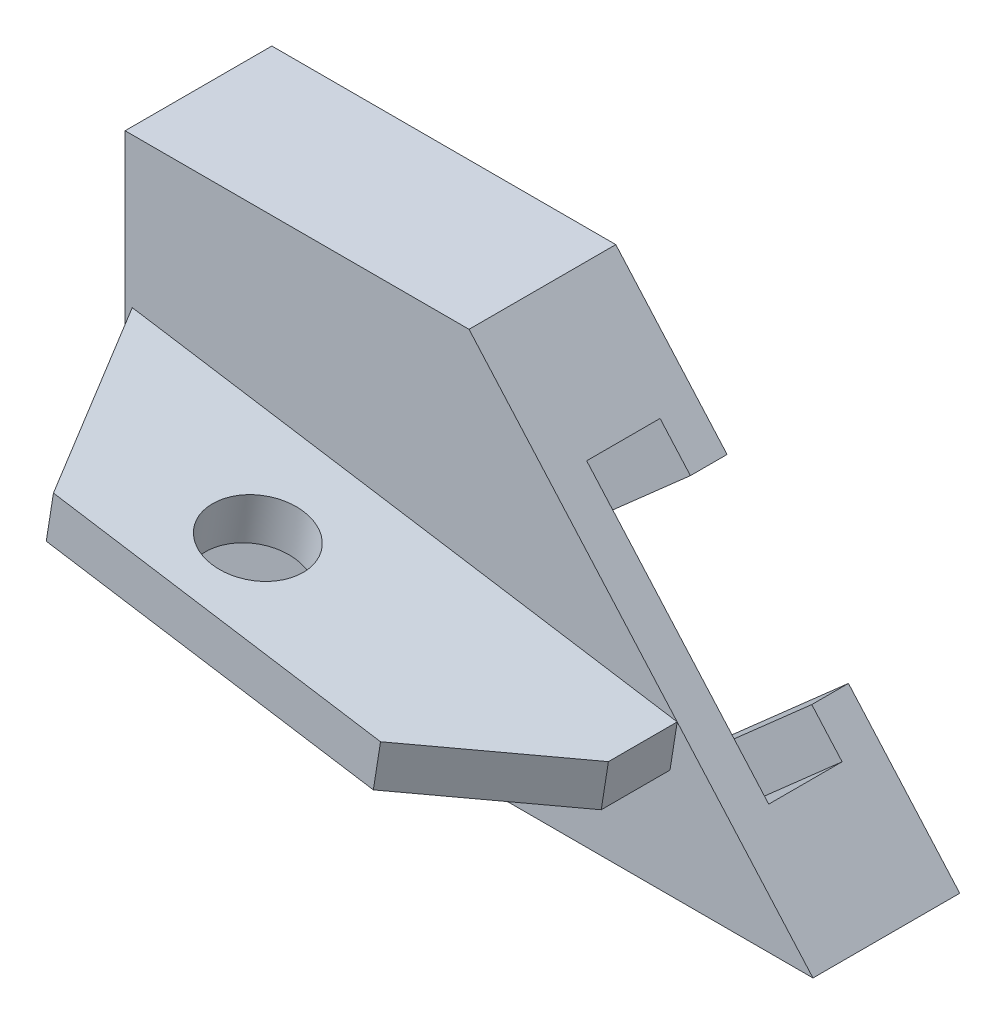
ISO-10303-21;
HEADER;
FILE_DESCRIPTION(('STEP AP214'),'2;1');
FILE_NAME('part.step','',(''),(''),'','','');
FILE_SCHEMA(('AUTOMOTIVE_DESIGN { 1 0 10303 214 1 1 1 1 }'));
ENDSEC;
DATA;
#1=APPLICATION_CONTEXT('core data for automotive mechanical design processes');
#2=APPLICATION_PROTOCOL_DEFINITION('international standard','automotive_design',2000,#1);
#3=PRODUCT_CONTEXT('',#1,'mechanical');
#4=PRODUCT('Part','Part','',(#3));
#5=PRODUCT_RELATED_PRODUCT_CATEGORY('part','',(#4));
#6=PRODUCT_DEFINITION_FORMATION('','',#4);
#7=PRODUCT_DEFINITION_CONTEXT('part definition',#1,'design');
#8=PRODUCT_DEFINITION('design','',#6,#7);
#9=PRODUCT_DEFINITION_SHAPE('','',#8);
#10=(LENGTH_UNIT() NAMED_UNIT(*) SI_UNIT(.MILLI.,.METRE.));
#11=(NAMED_UNIT(*) PLANE_ANGLE_UNIT() SI_UNIT($,.RADIAN.));
#12=(NAMED_UNIT(*) SI_UNIT($,.STERADIAN.) SOLID_ANGLE_UNIT());
#13=UNCERTAINTY_MEASURE_WITH_UNIT(LENGTH_MEASURE(1.E-05),#10,'distance_accuracy_value','');
#14=(GEOMETRIC_REPRESENTATION_CONTEXT(3) GLOBAL_UNCERTAINTY_ASSIGNED_CONTEXT((#13)) GLOBAL_UNIT_ASSIGNED_CONTEXT((#10,
#11,#12)) REPRESENTATION_CONTEXT('',''));
#15=CARTESIAN_POINT('',(0.,0.,0.));
#16=DIRECTION('',(0.,0.,1.));
#17=DIRECTION('',(1.,0.,0.));
#18=AXIS2_PLACEMENT_3D('',#15,#16,#17);
#19=CARTESIAN_POINT('',(112.260327889279,-17.7802892033924,72.));
#20=DIRECTION('',(0.987688340595138,-0.156434465040231,0.));
#21=DIRECTION('',(0.156434465040231,0.987688340595138,0.));
#22=AXIS2_PLACEMENT_3D('',#19,#20,#21);
#23=PLANE('',#22);
#24=DIRECTION('',(0.,0.,-1.));
#25=VECTOR('',#24,1.);
#26=CARTESIAN_POINT('',(120.391283670149,33.556545173831,72.));
#27=LINE('',#26,#25);
#28=CARTESIAN_POINT('',(120.391283670149,33.556545173831,47.));
#29=VERTEX_POINT('',#28);
#30=CARTESIAN_POINT('',(120.391283670149,33.556545173831,32.));
#31=VERTEX_POINT('',#30);
#32=EDGE_CURVE('E209',#29,#31,#27,.T.);
#33=ORIENTED_EDGE('',*,*,#32,.F.);
#34=DIRECTION('',(-0.156434465040231,-0.987688340595138,0.));
#35=VECTOR('',#34,1.);
#36=CARTESIAN_POINT('',(129.064490408317,88.317017354028,47.));
#37=LINE('',#36,#35);
#38=CARTESIAN_POINT('',(118.826939019747,23.6796617678796,47.));
#39=VERTEX_POINT('',#38);
#40=EDGE_CURVE('E192',#29,#39,#37,.T.);
#41=ORIENTED_EDGE('',*,*,#40,.T.);
#42=DIRECTION('',(0.,0.,-1.));
#43=VECTOR('',#42,1.);
#44=CARTESIAN_POINT('',(118.826939019747,23.6796617678796,72.));
#45=LINE('',#44,#43);
#46=CARTESIAN_POINT('',(118.826939019747,23.6796617678796,32.));
#47=VERTEX_POINT('',#46);
#48=EDGE_CURVE('E205',#39,#47,#45,.T.);
#49=ORIENTED_EDGE('',*,*,#48,.T.);
#50=DIRECTION('',(-0.156434465040231,-0.987688340595138,0.));
#51=VECTOR('',#50,1.);
#52=CARTESIAN_POINT('',(112.260327889279,-17.7802892033924,32.));
#53=LINE('',#52,#51);
#54=EDGE_CURVE('E264',#31,#47,#53,.T.);
#55=ORIENTED_EDGE('',*,*,#54,.F.);
#56=EDGE_LOOP('',(#33,#41,#49,#55));
#57=FACE_BOUND('',#56,.T.);
#58=ADVANCED_FACE('F68',(#57),#23,.T.);
#59=CARTESIAN_POINT('',(0.,0.,72.));
#60=DIRECTION('',(0.,0.,1.));
#61=DIRECTION('',(1.,0.,0.));
#62=AXIS2_PLACEMENT_3D('',#59,#60,#61);
#63=PLANE('',#62);
#64=DIRECTION('',(0.987688340595138,-0.156434465040231,0.));
#65=VECTOR('',#64,1.);
#66=CARTESIAN_POINT('',(8.13095578086995,51.3368343772234,72.));
#67=LINE('',#66,#65);
#68=CARTESIAN_POINT('',(24.3740298231243,48.7641841858909,72.));
#69=VERTEX_POINT('',#68);
#70=CARTESIAN_POINT('',(95.6990751552707,37.4674067998367,72.));
#71=VERTEX_POINT('',#70);
#72=EDGE_CURVE('E210',#69,#71,#67,.T.);
#73=ORIENTED_EDGE('',*,*,#72,.F.);
#74=DIRECTION('',(-0.156434465040231,-0.987688340595138,0.));
#75=VECTOR('',#74,1.);
#76=CARTESIAN_POINT('',(33.0472365612922,103.524656366088,72.));
#77=LINE('',#76,#75);
#78=CARTESIAN_POINT('',(22.809685172722,38.8873007799396,72.));
#79=VERTEX_POINT('',#78);
#80=EDGE_CURVE('E206',#69,#79,#77,.T.);
#81=ORIENTED_EDGE('',*,*,#80,.T.);
#82=DIRECTION('',(-0.987688340595138,0.156434465040231,0.));
#83=VECTOR('',#82,1.);
#84=CARTESIAN_POINT('',(6.56661113046764,41.459950971272,72.));
#85=LINE('',#84,#83);
#86=CARTESIAN_POINT('',(94.1347305048684,27.5905233938854,72.));
#87=VERTEX_POINT('',#86);
#88=EDGE_CURVE('E199',#87,#79,#85,.T.);
#89=ORIENTED_EDGE('',*,*,#88,.F.);
#90=DIRECTION('',(-0.156434465040231,-0.987688340595138,0.));
#91=VECTOR('',#90,1.);
#92=CARTESIAN_POINT('',(104.372281893439,92.2278789800338,72.));
#93=LINE('',#92,#91);
#94=EDGE_CURVE('E184',#71,#87,#93,.T.);
#95=ORIENTED_EDGE('',*,*,#94,.F.);
#96=EDGE_LOOP('',(#73,#81,#89,#95));
#97=FACE_BOUND('',#96,.T.);
#98=ADVANCED_FACE('F202',(#97),#63,.T.);
#99=CARTESIAN_POINT('',(8.13095578086995,51.3368343772234,72.));
#100=DIRECTION('',(0.156434465040231,0.987688340595138,0.));
#101=DIRECTION('',(-0.987688340595138,0.156434465040231,0.));
#102=AXIS2_PLACEMENT_3D('',#99,#100,#101);
#103=PLANE('',#102);
#104=CARTESIAN_POINT('',(50.9487616801592,44.5551601539398,54.));
#105=DIRECTION('',(0.156434465040231,0.987688340595138,0.));
#106=DIRECTION('',(-0.987688340595138,0.156434465040231,0.));
#107=AXIS2_PLACEMENT_3D('',#104,#105,#106);
#108=CIRCLE('',#107,10.);
#109=CARTESIAN_POINT('',(41.0718782742078,46.1195048043421,54.));
#110=VERTEX_POINT('',#109);
#111=EDGE_CURVE('E342',#110,#110,#108,.F.);
#112=ORIENTED_EDGE('',*,*,#111,.T.);
#113=EDGE_LOOP('',(#112));
#114=FACE_BOUND('',#113,.T.);
#115=DIRECTION('',(0.987688340595138,-0.156434465040231,0.));
#116=VECTOR('',#115,1.);
#117=CARTESIAN_POINT('',(8.13095578086995,51.3368343772234,32.));
#118=LINE('',#117,#116);
#119=CARTESIAN_POINT('',(1.56434465040231,52.3768834059514,32.));
#120=VERTEX_POINT('',#119);
#121=EDGE_CURVE('E232',#120,#31,#118,.T.);
#122=ORIENTED_EDGE('',*,*,#121,.F.);
#123=DIRECTION('',(0.493844170297564,-0.0782172325201147,0.866025403784442));
#124=VECTOR('',#123,1.);
#125=CARTESIAN_POINT('',(-10.4798136706141,54.2844906808057,10.8788696909855));
#126=LINE('',#125,#124);
#127=EDGE_CURVE('E201',#120,#69,#126,.T.);
#128=ORIENTED_EDGE('',*,*,#127,.T.);
#129=ORIENTED_EDGE('',*,*,#72,.T.);
#130=DIRECTION('',(0.698401123333712,-0.110615871041238,-0.707106781186546));
#131=VECTOR('',#130,1.);
#132=CARTESIAN_POINT('',(87.471795729495,38.7704798470818,80.3298334987109));
#133=LINE('',#132,#131);
#134=EDGE_CURVE('E95',#71,#29,#133,.T.);
#135=ORIENTED_EDGE('',*,*,#134,.T.);
#136=ORIENTED_EDGE('',*,*,#32,.T.);
#137=EDGE_LOOP('',(#122,#128,#129,#135,#136));
#138=FACE_BOUND('',#137,.T.);
#139=ADVANCED_FACE('F357',(#114,#138),#103,.T.);
#140=CARTESIAN_POINT('',(0.,0.,0.));
#141=DIRECTION('',(0.,0.,1.));
#142=DIRECTION('',(1.,0.,0.));
#143=AXIS2_PLACEMENT_3D('',#140,#141,#142);
#144=PLANE('',#143);
#145=DIRECTION('',(0.749837855365093,0.661621637086846,0.));
#146=VECTOR('',#145,1.);
#147=CARTESIAN_POINT('',(14.9279874917261,-16.9205191572896,0.));
#148=LINE('',#147,#146);
#149=CARTESIAN_POINT('',(34.1045758699877,0.,0.));
#150=VERTEX_POINT('',#149);
#151=CARTESIAN_POINT('',(99.2675672582631,57.4967571073019,0.));
#152=VERTEX_POINT('',#151);
#153=EDGE_CURVE('E256',#150,#152,#148,.T.);
#154=ORIENTED_EDGE('',*,*,#153,.F.);
#155=DIRECTION('',(1.,0.,0.));
#156=VECTOR('',#155,1.);
#157=CARTESIAN_POINT('',(0.,0.,0.));
#158=LINE('',#157,#156);
#159=CARTESIAN_POINT('',(0.,0.,0.));
#160=VERTEX_POINT('',#159);
#161=EDGE_CURVE('E260',#160,#150,#158,.T.);
#162=ORIENTED_EDGE('',*,*,#161,.F.);
#163=DIRECTION('',(0.,1.,0.));
#164=VECTOR('',#163,1.);
#165=CARTESIAN_POINT('',(0.,0.,0.));
#166=LINE('',#165,#164);
#167=CARTESIAN_POINT('',(0.,85.,0.));
#168=VERTEX_POINT('',#167);
#169=EDGE_CURVE('E221',#160,#168,#166,.T.);
#170=ORIENTED_EDGE('',*,*,#169,.T.);
#171=DIRECTION('',(1.,0.,0.));
#172=VECTOR('',#171,1.);
#173=CARTESIAN_POINT('',(0.,85.,0.));
#174=LINE('',#173,#172);
#175=CARTESIAN_POINT('',(75.,85.,0.));
#176=VERTEX_POINT('',#175);
#177=EDGE_CURVE('E239',#168,#176,#174,.T.);
#178=ORIENTED_EDGE('',*,*,#177,.T.);
#179=DIRECTION('',(0.661621637086846,-0.749837855365093,0.));
#180=VECTOR('',#179,1.);
#181=CARTESIAN_POINT('',(84.3385214007782,74.4163424124513,0.));
#182=LINE('',#181,#180);
#183=EDGE_CURVE('E237',#176,#152,#182,.T.);
#184=ORIENTED_EDGE('',*,*,#183,.T.);
#185=EDGE_LOOP('',(#154,#162,#170,#178,#184));
#186=FACE_BOUND('',#185,.T.);
#187=ADVANCED_FACE('F254',(#186),#144,.F.);
#188=CARTESIAN_POINT('',(84.3385214007782,74.4163424124513,32.));
#189=DIRECTION('',(0.749837855365093,0.661621637086846,0.));
#190=DIRECTION('',(-0.661621637086846,0.749837855365093,0.));
#191=AXIS2_PLACEMENT_3D('',#188,#189,#190);
#192=PLANE('',#191);
#193=DIRECTION('',(0.661621637086846,-0.749837855365093,0.));
#194=VECTOR('',#193,1.);
#195=CARTESIAN_POINT('',(84.3385214007783,74.4163424124514,8.));
#196=LINE('',#195,#194);
#197=CARTESIAN_POINT('',(92.6513508873947,64.9951356609528,8.));
#198=VERTEX_POINT('',#197);
#199=CARTESIAN_POINT('',(99.2675672582631,57.4967571073019,8.));
#200=VERTEX_POINT('',#199);
#201=EDGE_CURVE('E314',#198,#200,#196,.T.);
#202=ORIENTED_EDGE('',*,*,#201,.T.);
#203=DIRECTION('',(0.,0.,-1.));
#204=VECTOR('',#203,1.);
#205=CARTESIAN_POINT('',(99.2675672582631,57.4967571073019,0.));
#206=LINE('',#205,#204);
#207=EDGE_CURVE('E320',#200,#152,#206,.T.);
#208=ORIENTED_EDGE('',*,*,#207,.T.);
#209=ORIENTED_EDGE('',*,*,#183,.F.);
#210=DIRECTION('',(0.,0.,-1.));
#211=VECTOR('',#210,1.);
#212=CARTESIAN_POINT('',(75.,85.,32.));
#213=LINE('',#212,#211);
#214=CARTESIAN_POINT('',(75.,85.,32.));
#215=VERTEX_POINT('',#214);
#216=EDGE_CURVE('E12',#215,#176,#213,.T.);
#217=ORIENTED_EDGE('',*,*,#216,.F.);
#218=DIRECTION('',(0.661621637086846,-0.749837855365093,0.));
#219=VECTOR('',#218,1.);
#220=CARTESIAN_POINT('',(84.3385214007782,74.4163424124513,32.));
#221=LINE('',#220,#219);
#222=EDGE_CURVE('E219',#215,#31,#221,.T.);
#223=ORIENTED_EDGE('',*,*,#222,.T.);
#224=DIRECTION('',(0.661621637086846,-0.749837855365093,0.));
#225=VECTOR('',#224,1.);
#226=CARTESIAN_POINT('',(84.3385214007782,74.4163424124513,32.));
#227=LINE('',#226,#225);
#228=CARTESIAN_POINT('',(150.,0.,32.));
#229=VERTEX_POINT('',#228);
#230=EDGE_CURVE('E261',#31,#229,#227,.T.);
#231=ORIENTED_EDGE('',*,*,#230,.T.);
#232=DIRECTION('',(0.,0.,-1.));
#233=VECTOR('',#232,1.);
#234=CARTESIAN_POINT('',(150.,0.,32.));
#235=LINE('',#234,#233);
#236=CARTESIAN_POINT('',(150.,0.,0.));
#237=VERTEX_POINT('',#236);
#238=EDGE_CURVE('E213',#229,#237,#235,.T.);
#239=ORIENTED_EDGE('',*,*,#238,.T.);
#240=CARTESIAN_POINT('',(125.732432741737,27.5032428926982,0.));
#241=VERTEX_POINT('',#240);
#242=EDGE_CURVE('E218',#241,#237,#182,.T.);
#243=ORIENTED_EDGE('',*,*,#242,.F.);
#244=DIRECTION('',(0.,0.,-1.));
#245=VECTOR('',#244,1.);
#246=CARTESIAN_POINT('',(125.732432741737,27.5032428926982,0.));
#247=LINE('',#246,#245);
#248=CARTESIAN_POINT('',(125.732432741737,27.5032428926982,8.00000000000001));
#249=VERTEX_POINT('',#248);
#250=EDGE_CURVE('E319',#249,#241,#247,.T.);
#251=ORIENTED_EDGE('',*,*,#250,.F.);
#252=DIRECTION('',(0.661621637086846,-0.749837855365093,0.));
#253=VECTOR('',#252,1.);
#254=CARTESIAN_POINT('',(84.3385214007783,74.4163424124514,7.99999999999999));
#255=LINE('',#254,#253);
#256=CARTESIAN_POINT('',(132.348649112605,20.0048643390473,8.00000000000001));
#257=VERTEX_POINT('',#256);
#258=EDGE_CURVE('E325',#249,#257,#255,.T.);
#259=ORIENTED_EDGE('',*,*,#258,.T.);
#260=DIRECTION('',(0.,0.,-1.));
#261=VECTOR('',#260,1.);
#262=CARTESIAN_POINT('',(132.348649112605,20.0048643390473,0.));
#263=LINE('',#262,#261);
#264=CARTESIAN_POINT('',(132.348649112605,20.0048643390473,24.));
#265=VERTEX_POINT('',#264);
#266=EDGE_CURVE('E291',#265,#257,#263,.T.);
#267=ORIENTED_EDGE('',*,*,#266,.F.);
#268=DIRECTION('',(0.661621637086846,-0.749837855365093,0.));
#269=VECTOR('',#268,1.);
#270=CARTESIAN_POINT('',(84.3385214007783,74.4163424124514,24.));
#271=LINE('',#270,#269);
#272=CARTESIAN_POINT('',(92.6513508873947,64.9951356609528,24.));
#273=VERTEX_POINT('',#272);
#274=EDGE_CURVE('E306',#273,#265,#271,.T.);
#275=ORIENTED_EDGE('',*,*,#274,.F.);
#276=DIRECTION('',(0.,0.,-1.));
#277=VECTOR('',#276,1.);
#278=CARTESIAN_POINT('',(92.6513508873947,64.9951356609528,0.));
#279=LINE('',#278,#277);
#280=EDGE_CURVE('E313',#273,#198,#279,.T.);
#281=ORIENTED_EDGE('',*,*,#280,.T.);
#282=EDGE_LOOP('',(#202,#208,#209,#217,#223,#231,#239,#243,#251,#259,#267,#275,#281));
#283=FACE_BOUND('',#282,.T.);
#284=ADVANCED_FACE('F72',(#283),#192,.T.);
#285=CARTESIAN_POINT('',(0.,85.,32.));
#286=DIRECTION('',(0.,1.,0.));
#287=DIRECTION('',(0.,0.,1.));
#288=AXIS2_PLACEMENT_3D('',#285,#286,#287);
#289=PLANE('',#288);
#290=ORIENTED_EDGE('',*,*,#177,.F.);
#291=DIRECTION('',(0.,0.,-1.));
#292=VECTOR('',#291,1.);
#293=CARTESIAN_POINT('',(0.,85.,32.));
#294=LINE('',#293,#292);
#295=CARTESIAN_POINT('',(0.,85.,32.));
#296=VERTEX_POINT('',#295);
#297=EDGE_CURVE('E80',#296,#168,#294,.T.);
#298=ORIENTED_EDGE('',*,*,#297,.F.);
#299=DIRECTION('',(1.,0.,0.));
#300=VECTOR('',#299,1.);
#301=CARTESIAN_POINT('',(0.,85.,32.));
#302=LINE('',#301,#300);
#303=EDGE_CURVE('E224',#296,#215,#302,.T.);
#304=ORIENTED_EDGE('',*,*,#303,.T.);
#305=ORIENTED_EDGE('',*,*,#216,.T.);
#306=EDGE_LOOP('',(#290,#298,#304,#305));
#307=FACE_BOUND('',#306,.T.);
#308=ADVANCED_FACE('F249',(#307),#289,.T.);
#309=CARTESIAN_POINT('',(0.,0.,32.));
#310=DIRECTION('',(-1.,0.,0.));
#311=DIRECTION('',(0.,0.,1.));
#312=AXIS2_PLACEMENT_3D('',#309,#310,#311);
#313=PLANE('',#312);
#314=ORIENTED_EDGE('',*,*,#169,.F.);
#315=DIRECTION('',(0.,0.,-1.));
#316=VECTOR('',#315,1.);
#317=CARTESIAN_POINT('',(0.,0.,32.));
#318=LINE('',#317,#316);
#319=CARTESIAN_POINT('',(0.,0.,32.));
#320=VERTEX_POINT('',#319);
#321=EDGE_CURVE('E208',#320,#160,#318,.T.);
#322=ORIENTED_EDGE('',*,*,#321,.F.);
#323=DIRECTION('',(0.,1.,0.));
#324=VECTOR('',#323,1.);
#325=CARTESIAN_POINT('',(0.,0.,32.));
#326=LINE('',#325,#324);
#327=CARTESIAN_POINT('',(0.,42.5,32.));
#328=VERTEX_POINT('',#327);
#329=EDGE_CURVE('E277',#320,#328,#326,.T.);
#330=ORIENTED_EDGE('',*,*,#329,.T.);
#331=DIRECTION('',(0.,1.,0.));
#332=VECTOR('',#331,1.);
#333=CARTESIAN_POINT('',(0.,0.,32.));
#334=LINE('',#333,#332);
#335=EDGE_CURVE('E230',#328,#296,#334,.T.);
#336=ORIENTED_EDGE('',*,*,#335,.T.);
#337=ORIENTED_EDGE('',*,*,#297,.T.);
#338=EDGE_LOOP('',(#314,#322,#330,#336,#337));
#339=FACE_BOUND('',#338,.T.);
#340=ADVANCED_FACE('F243',(#339),#313,.T.);
#341=CARTESIAN_POINT('',(0.,0.,32.));
#342=DIRECTION('',(0.,0.,1.));
#343=DIRECTION('',(1.,0.,0.));
#344=AXIS2_PLACEMENT_3D('',#341,#342,#343);
#345=PLANE('',#344);
#346=ORIENTED_EDGE('',*,*,#222,.F.);
#347=ORIENTED_EDGE('',*,*,#303,.F.);
#348=ORIENTED_EDGE('',*,*,#335,.F.);
#349=DIRECTION('',(0.156434465040231,0.987688340595138,0.));
#350=VECTOR('',#349,1.);
#351=CARTESIAN_POINT('',(-6.56661113046764,1.04004902872799,32.));
#352=LINE('',#351,#350);
#353=EDGE_CURVE('E228',#328,#120,#352,.T.);
#354=ORIENTED_EDGE('',*,*,#353,.T.);
#355=ORIENTED_EDGE('',*,*,#121,.T.);
#356=EDGE_LOOP('',(#346,#347,#348,#354,#355));
#357=FACE_BOUND('',#356,.T.);
#358=ADVANCED_FACE('F362',(#357),#345,.T.);
#359=CARTESIAN_POINT('',(94.562090796679,0.,0.));
#360=VERTEX_POINT('',#359);
#361=EDGE_CURVE('E265',#360,#237,#158,.T.);
#362=ORIENTED_EDGE('',*,*,#361,.F.);
#363=DIRECTION('',(0.749837855365093,0.661621637086846,0.));
#364=VECTOR('',#363,1.);
#365=CARTESIAN_POINT('',(41.3928529752,-46.9140333718933,0.));
#366=LINE('',#365,#364);
#367=EDGE_CURVE('E295',#360,#241,#366,.T.);
#368=ORIENTED_EDGE('',*,*,#367,.T.);
#369=ORIENTED_EDGE('',*,*,#242,.T.);
#370=EDGE_LOOP('',(#362,#368,#369));
#371=FACE_BOUND('',#370,.T.);
#372=ADVANCED_FACE('F391',(#371),#144,.F.);
#373=CARTESIAN_POINT('',(6.56661113046764,41.459950971272,72.));
#374=DIRECTION('',(-0.156434465040231,-0.987688340595138,0.));
#375=DIRECTION('',(0.987688340595138,-0.156434465040231,0.));
#376=AXIS2_PLACEMENT_3D('',#373,#374,#375);
#377=PLANE('',#376);
#378=DIRECTION('',(0.493844170297564,-0.0782172325201147,0.866025403784442));
#379=VECTOR('',#378,1.);
#380=CARTESIAN_POINT('',(-12.0441583210164,44.4076072748543,10.8788696909855));
#381=LINE('',#380,#379);
#382=EDGE_CURVE('E83',#328,#79,#381,.T.);
#383=ORIENTED_EDGE('',*,*,#382,.F.);
#384=DIRECTION('',(-0.987688340595138,0.156434465040231,0.));
#385=VECTOR('',#384,1.);
#386=CARTESIAN_POINT('',(6.56661113046764,41.459950971272,32.));
#387=LINE('',#386,#385);
#388=EDGE_CURVE('E282',#47,#328,#387,.T.);
#389=ORIENTED_EDGE('',*,*,#388,.F.);
#390=ORIENTED_EDGE('',*,*,#48,.F.);
#391=DIRECTION('',(0.698401123333712,-0.110615871041238,-0.707106781186546));
#392=VECTOR('',#391,1.);
#393=CARTESIAN_POINT('',(85.9074510790927,28.8935964411304,80.3298334987109));
#394=LINE('',#393,#392);
#395=EDGE_CURVE('E190',#87,#39,#394,.T.);
#396=ORIENTED_EDGE('',*,*,#395,.F.);
#397=ORIENTED_EDGE('',*,*,#88,.T.);
#398=EDGE_LOOP('',(#383,#389,#390,#396,#397));
#399=FACE_BOUND('',#398,.T.);
#400=CARTESIAN_POINT('',(49.3844170297569,34.6782767479885,54.));
#401=DIRECTION('',(-0.156434465040231,-0.987688340595138,0.));
#402=DIRECTION('',(0.987688340595138,-0.156434465040231,0.));
#403=AXIS2_PLACEMENT_3D('',#400,#401,#402);
#404=CIRCLE('',#403,10.);
#405=CARTESIAN_POINT('',(59.2613004357083,33.1139320975862,54.));
#406=VERTEX_POINT('',#405);
#407=EDGE_CURVE('E345',#406,#406,#404,.T.);
#408=ORIENTED_EDGE('',*,*,#407,.F.);
#409=EDGE_LOOP('',(#408));
#410=FACE_BOUND('',#409,.T.);
#411=ADVANCED_FACE('F196',(#399,#410),#377,.T.);
#412=CARTESIAN_POINT('',(0.,0.,32.));
#413=DIRECTION('',(0.,1.,0.));
#414=DIRECTION('',(0.,0.,1.));
#415=AXIS2_PLACEMENT_3D('',#412,#413,#414);
#416=PLANE('',#415);
#417=ORIENTED_EDGE('',*,*,#161,.T.);
#418=DIRECTION('',(0.,0.,1.));
#419=VECTOR('',#418,1.);
#420=CARTESIAN_POINT('',(34.1045758699877,0.,0.));
#421=LINE('',#420,#419);
#422=CARTESIAN_POINT('',(34.1045758699877,0.,8.));
#423=VERTEX_POINT('',#422);
#424=EDGE_CURVE('E324',#150,#423,#421,.T.);
#425=ORIENTED_EDGE('',*,*,#424,.T.);
#426=DIRECTION('',(-1.,0.,0.));
#427=VECTOR('',#426,1.);
#428=CARTESIAN_POINT('',(-0.00105836575875484,0.,8.));
#429=LINE('',#428,#427);
#430=CARTESIAN_POINT('',(18.9901971383148,0.,8.));
#431=VERTEX_POINT('',#430);
#432=EDGE_CURVE('E330',#423,#431,#429,.T.);
#433=ORIENTED_EDGE('',*,*,#432,.T.);
#434=DIRECTION('',(0.,0.,1.));
#435=VECTOR('',#434,1.);
#436=CARTESIAN_POINT('',(18.9901971383148,0.,0.));
#437=LINE('',#436,#435);
#438=CARTESIAN_POINT('',(18.9901971383148,0.,24.));
#439=VERTEX_POINT('',#438);
#440=EDGE_CURVE('E329',#431,#439,#437,.T.);
#441=ORIENTED_EDGE('',*,*,#440,.T.);
#442=DIRECTION('',(-1.,0.,0.));
#443=VECTOR('',#442,1.);
#444=CARTESIAN_POINT('',(-0.00105836575875484,0.,24.));
#445=LINE('',#444,#443);
#446=CARTESIAN_POINT('',(109.676469528352,0.,24.));
#447=VERTEX_POINT('',#446);
#448=EDGE_CURVE('E334',#447,#439,#445,.T.);
#449=ORIENTED_EDGE('',*,*,#448,.F.);
#450=DIRECTION('',(0.,0.,1.));
#451=VECTOR('',#450,1.);
#452=CARTESIAN_POINT('',(109.676469528352,0.,0.));
#453=LINE('',#452,#451);
#454=CARTESIAN_POINT('',(109.676469528352,0.,8.00000000000001));
#455=VERTEX_POINT('',#454);
#456=EDGE_CURVE('E337',#455,#447,#453,.T.);
#457=ORIENTED_EDGE('',*,*,#456,.F.);
#458=DIRECTION('',(-1.,0.,0.));
#459=VECTOR('',#458,1.);
#460=CARTESIAN_POINT('',(-0.00105836575875484,0.,7.99999999999999));
#461=LINE('',#460,#459);
#462=CARTESIAN_POINT('',(94.562090796679,0.,8.00000000000001));
#463=VERTEX_POINT('',#462);
#464=EDGE_CURVE('E336',#455,#463,#461,.T.);
#465=ORIENTED_EDGE('',*,*,#464,.T.);
#466=DIRECTION('',(0.,0.,1.));
#467=VECTOR('',#466,1.);
#468=CARTESIAN_POINT('',(94.562090796679,0.,0.));
#469=LINE('',#468,#467);
#470=EDGE_CURVE('E268',#360,#463,#469,.T.);
#471=ORIENTED_EDGE('',*,*,#470,.F.);
#472=ORIENTED_EDGE('',*,*,#361,.T.);
#473=ORIENTED_EDGE('',*,*,#238,.F.);
#474=DIRECTION('',(1.,0.,0.));
#475=VECTOR('',#474,1.);
#476=CARTESIAN_POINT('',(0.,0.,32.));
#477=LINE('',#476,#475);
#478=EDGE_CURVE('E269',#320,#229,#477,.T.);
#479=ORIENTED_EDGE('',*,*,#478,.F.);
#480=ORIENTED_EDGE('',*,*,#321,.T.);
#481=EDGE_LOOP('',(#417,#425,#433,#441,#449,#457,#465,#471,#472,#473,#479,#480));
#482=FACE_BOUND('',#481,.T.);
#483=ADVANCED_FACE('F369',(#482),#416,.F.);
#484=CARTESIAN_POINT('',(0.,0.,32.));
#485=DIRECTION('',(0.,0.,1.));
#486=DIRECTION('',(1.,0.,0.));
#487=AXIS2_PLACEMENT_3D('',#484,#485,#486);
#488=PLANE('',#487);
#489=ORIENTED_EDGE('',*,*,#230,.F.);
#490=ORIENTED_EDGE('',*,*,#54,.T.);
#491=ORIENTED_EDGE('',*,*,#388,.T.);
#492=ORIENTED_EDGE('',*,*,#329,.F.);
#493=ORIENTED_EDGE('',*,*,#478,.T.);
#494=EDGE_LOOP('',(#489,#490,#491,#492,#493));
#495=FACE_BOUND('',#494,.T.);
#496=ADVANCED_FACE('F361',(#495),#488,.T.);
#497=CARTESIAN_POINT('',(-0.00105836575875484,-0.000933852140089231,7.99999999999999));
#498=DIRECTION('',(0.,0.,1.));
#499=DIRECTION('',(0.,-1.,0.));
#500=AXIS2_PLACEMENT_3D('',#497,#498,#499);
#501=PLANE('',#500);
#502=DIRECTION('',(0.749837855365093,0.661621637086846,0.));
#503=VECTOR('',#502,1.);
#504=CARTESIAN_POINT('',(48.0090693460684,-54.4124119255442,8.00000000000001));
#505=LINE('',#504,#503);
#506=EDGE_CURVE('E288',#455,#257,#505,.T.);
#507=ORIENTED_EDGE('',*,*,#506,.T.);
#508=ORIENTED_EDGE('',*,*,#258,.F.);
#509=DIRECTION('',(0.749837855365093,0.661621637086846,0.));
#510=VECTOR('',#509,1.);
#511=CARTESIAN_POINT('',(41.3928529752,-46.9140333718933,8.00000000000001));
#512=LINE('',#511,#510);
#513=EDGE_CURVE('E289',#463,#249,#512,.T.);
#514=ORIENTED_EDGE('',*,*,#513,.F.);
#515=ORIENTED_EDGE('',*,*,#464,.F.);
#516=EDGE_LOOP('',(#507,#508,#514,#515));
#517=FACE_BOUND('',#516,.T.);
#518=ADVANCED_FACE('F389',(#517),#501,.T.);
#519=CARTESIAN_POINT('',(48.0090693460684,-54.4124119255442,0.));
#520=DIRECTION('',(0.661621637086846,-0.749837855365093,0.));
#521=DIRECTION('',(0.749837855365093,0.661621637086846,0.));
#522=AXIS2_PLACEMENT_3D('',#519,#520,#521);
#523=PLANE('',#522);
#524=ORIENTED_EDGE('',*,*,#456,.T.);
#525=DIRECTION('',(0.749837855365093,0.661621637086846,0.));
#526=VECTOR('',#525,1.);
#527=CARTESIAN_POINT('',(48.0090693460684,-54.4124119255442,24.));
#528=LINE('',#527,#526);
#529=EDGE_CURVE('E302',#447,#265,#528,.T.);
#530=ORIENTED_EDGE('',*,*,#529,.T.);
#531=ORIENTED_EDGE('',*,*,#266,.T.);
#532=ORIENTED_EDGE('',*,*,#506,.F.);
#533=EDGE_LOOP('',(#524,#530,#531,#532));
#534=FACE_BOUND('',#533,.T.);
#535=ADVANCED_FACE('F383',(#534),#523,.F.);
#536=CARTESIAN_POINT('',(-0.00105836575875484,-0.000933852140089231,24.));
#537=DIRECTION('',(0.,0.,1.));
#538=DIRECTION('',(0.,-1.,0.));
#539=AXIS2_PLACEMENT_3D('',#536,#537,#538);
#540=PLANE('',#539);
#541=ORIENTED_EDGE('',*,*,#448,.T.);
#542=DIRECTION('',(0.749837855365093,0.661621637086846,0.));
#543=VECTOR('',#542,1.);
#544=CARTESIAN_POINT('',(8.31177112085764,-9.42214060363866,24.));
#545=LINE('',#544,#543);
#546=EDGE_CURVE('E301',#439,#273,#545,.T.);
#547=ORIENTED_EDGE('',*,*,#546,.T.);
#548=ORIENTED_EDGE('',*,*,#274,.T.);
#549=ORIENTED_EDGE('',*,*,#529,.F.);
#550=EDGE_LOOP('',(#541,#547,#548,#549));
#551=FACE_BOUND('',#550,.T.);
#552=ADVANCED_FACE('F377',(#551),#540,.F.);
#553=CARTESIAN_POINT('',(8.31177112085764,-9.42214060363866,0.));
#554=DIRECTION('',(0.661621637086846,-0.749837855365093,0.));
#555=DIRECTION('',(0.749837855365093,0.661621637086846,0.));
#556=AXIS2_PLACEMENT_3D('',#553,#554,#555);
#557=PLANE('',#556);
#558=DIRECTION('',(0.749837855365093,0.661621637086846,0.));
#559=VECTOR('',#558,1.);
#560=CARTESIAN_POINT('',(8.31177112085764,-9.42214060363866,8.));
#561=LINE('',#560,#559);
#562=EDGE_CURVE('E296',#431,#198,#561,.T.);
#563=ORIENTED_EDGE('',*,*,#562,.T.);
#564=ORIENTED_EDGE('',*,*,#280,.F.);
#565=ORIENTED_EDGE('',*,*,#546,.F.);
#566=ORIENTED_EDGE('',*,*,#440,.F.);
#567=EDGE_LOOP('',(#563,#564,#565,#566));
#568=FACE_BOUND('',#567,.T.);
#569=ADVANCED_FACE('F376',(#568),#557,.T.);
#570=CARTESIAN_POINT('',(-0.00105836575875484,-0.000933852140089231,8.));
#571=DIRECTION('',(0.,0.,1.));
#572=DIRECTION('',(0.,-1.,0.));
#573=AXIS2_PLACEMENT_3D('',#570,#571,#572);
#574=PLANE('',#573);
#575=DIRECTION('',(0.749837855365093,0.661621637086846,0.));
#576=VECTOR('',#575,1.);
#577=CARTESIAN_POINT('',(14.9279874917261,-16.9205191572896,8.));
#578=LINE('',#577,#576);
#579=EDGE_CURVE('E300',#423,#200,#578,.T.);
#580=ORIENTED_EDGE('',*,*,#579,.T.);
#581=ORIENTED_EDGE('',*,*,#201,.F.);
#582=ORIENTED_EDGE('',*,*,#562,.F.);
#583=ORIENTED_EDGE('',*,*,#432,.F.);
#584=EDGE_LOOP('',(#580,#581,#582,#583));
#585=FACE_BOUND('',#584,.T.);
#586=ADVANCED_FACE('F373',(#585),#574,.T.);
#587=CARTESIAN_POINT('',(14.9279874917261,-16.9205191572896,0.));
#588=DIRECTION('',(0.661621637086846,-0.749837855365093,0.));
#589=DIRECTION('',(0.749837855365093,0.661621637086846,0.));
#590=AXIS2_PLACEMENT_3D('',#587,#588,#589);
#591=PLANE('',#590);
#592=ORIENTED_EDGE('',*,*,#153,.T.);
#593=ORIENTED_EDGE('',*,*,#207,.F.);
#594=ORIENTED_EDGE('',*,*,#579,.F.);
#595=ORIENTED_EDGE('',*,*,#424,.F.);
#596=EDGE_LOOP('',(#592,#593,#594,#595));
#597=FACE_BOUND('',#596,.T.);
#598=ADVANCED_FACE('F370',(#597),#591,.T.);
#599=CARTESIAN_POINT('',(41.3928529752,-46.9140333718933,0.));
#600=DIRECTION('',(0.661621637086846,-0.749837855365093,0.));
#601=DIRECTION('',(0.749837855365093,0.661621637086846,0.));
#602=AXIS2_PLACEMENT_3D('',#599,#600,#601);
#603=PLANE('',#602);
#604=ORIENTED_EDGE('',*,*,#470,.T.);
#605=ORIENTED_EDGE('',*,*,#513,.T.);
#606=ORIENTED_EDGE('',*,*,#250,.T.);
#607=ORIENTED_EDGE('',*,*,#367,.F.);
#608=EDGE_LOOP('',(#604,#605,#606,#607));
#609=FACE_BOUND('',#608,.T.);
#610=ADVANCED_FACE('F392',(#609),#603,.F.);
#611=CARTESIAN_POINT('',(59.6219684183271,99.3156323341369,54.));
#612=DIRECTION('',(-0.156434465040231,-0.987688340595138,0.));
#613=DIRECTION('',(0.987688340595138,-0.156434465040231,0.));
#614=AXIS2_PLACEMENT_3D('',#611,#612,#613);
#615=CYLINDRICAL_SURFACE('',#614,10.);
#616=ORIENTED_EDGE('',*,*,#111,.F.);
#617=EDGE_LOOP('',(#616));
#618=FACE_BOUND('',#617,.T.);
#619=ORIENTED_EDGE('',*,*,#407,.T.);
#620=EDGE_LOOP('',(#619));
#621=FACE_BOUND('',#620,.T.);
#622=ADVANCED_FACE('F424',(#618,#621),#615,.F.);
#623=CARTESIAN_POINT('',(96.1450024676629,93.5309520272788,80.3298334987109));
#624=DIRECTION('',(-0.698401123333709,0.110615871041237,-0.707106781186549));
#625=DIRECTION('',(-0.711472923612864,0.,0.702713511301557));
#626=AXIS2_PLACEMENT_3D('',#623,#624,#625);
#627=PLANE('',#626);
#628=ORIENTED_EDGE('',*,*,#94,.T.);
#629=ORIENTED_EDGE('',*,*,#395,.T.);
#630=ORIENTED_EDGE('',*,*,#40,.F.);
#631=ORIENTED_EDGE('',*,*,#134,.F.);
#632=EDGE_LOOP('',(#628,#629,#630,#631));
#633=FACE_BOUND('',#632,.T.);
#634=ADVANCED_FACE('F187',(#633),#627,.F.);
#635=CARTESIAN_POINT('',(-1.80660693244623,109.044962861003,10.8788696909855));
#636=DIRECTION('',(0.855363193977089,-0.135476220752269,-0.499999999999995));
#637=DIRECTION('',(-0.504652595083946,0.,-0.86332251115967));
#638=AXIS2_PLACEMENT_3D('',#635,#636,#637);
#639=PLANE('',#638);
#640=ORIENTED_EDGE('',*,*,#353,.F.);
#641=ORIENTED_EDGE('',*,*,#382,.T.);
#642=ORIENTED_EDGE('',*,*,#80,.F.);
#643=ORIENTED_EDGE('',*,*,#127,.F.);
#644=EDGE_LOOP('',(#640,#641,#642,#643));
#645=FACE_BOUND('',#644,.T.);
#646=ADVANCED_FACE('F358',(#645),#639,.F.);
#647=CLOSED_SHELL('',(#58,#98,#139,#187,#284,#308,#340,#358,#372,#411,#483,#496,#518,#535,#552,
#569,#586,#598,#610,#622,#634,#646));
#648=MANIFOLD_SOLID_BREP('B2',#647);
#649=ADVANCED_BREP_SHAPE_REPRESENTATION('',(#18,#648),#14);
#650=SHAPE_DEFINITION_REPRESENTATION(#9,#649);
ENDSEC;
END-ISO-10303-21;
